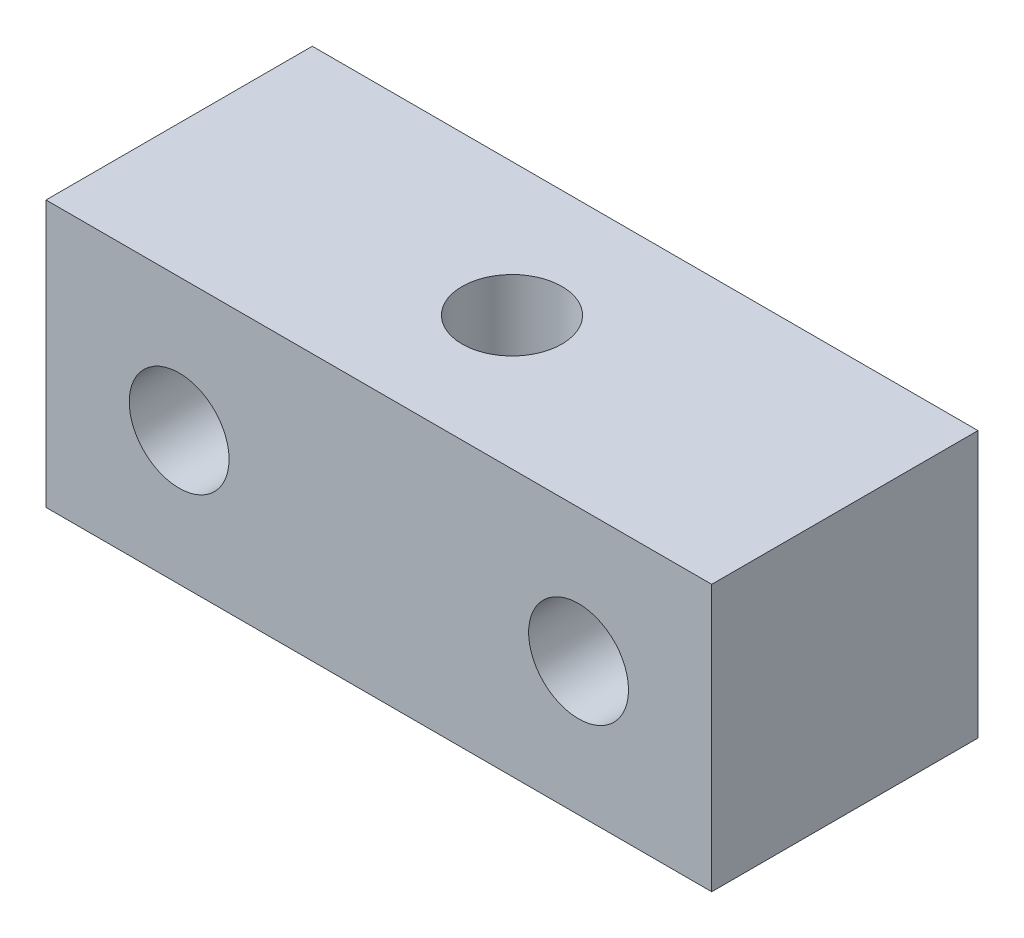
ISO-10303-21;
HEADER;
FILE_DESCRIPTION(('STEP AP214'),'2;1');
FILE_NAME('part.step','',(''),(''),'','','');
FILE_SCHEMA(('AUTOMOTIVE_DESIGN { 1 0 10303 214 1 1 1 1 }'));
ENDSEC;
DATA;
#1=APPLICATION_CONTEXT('core data for automotive mechanical design processes');
#2=APPLICATION_PROTOCOL_DEFINITION('international standard','automotive_design',2000,#1);
#3=PRODUCT_CONTEXT('',#1,'mechanical');
#4=PRODUCT('Part','Part','',(#3));
#5=PRODUCT_RELATED_PRODUCT_CATEGORY('part','',(#4));
#6=PRODUCT_DEFINITION_FORMATION('','',#4);
#7=PRODUCT_DEFINITION_CONTEXT('part definition',#1,'design');
#8=PRODUCT_DEFINITION('design','',#6,#7);
#9=PRODUCT_DEFINITION_SHAPE('','',#8);
#10=(LENGTH_UNIT() NAMED_UNIT(*) SI_UNIT(.MILLI.,.METRE.));
#11=(NAMED_UNIT(*) PLANE_ANGLE_UNIT() SI_UNIT($,.RADIAN.));
#12=(NAMED_UNIT(*) SI_UNIT($,.STERADIAN.) SOLID_ANGLE_UNIT());
#13=UNCERTAINTY_MEASURE_WITH_UNIT(LENGTH_MEASURE(1.E-05),#10,'distance_accuracy_value','');
#14=(GEOMETRIC_REPRESENTATION_CONTEXT(3) GLOBAL_UNCERTAINTY_ASSIGNED_CONTEXT((#13)) GLOBAL_UNIT_ASSIGNED_CONTEXT((#10,
#11,#12)) REPRESENTATION_CONTEXT('',''));
#15=CARTESIAN_POINT('',(0.,0.,0.));
#16=DIRECTION('',(0.,0.,1.));
#17=DIRECTION('',(1.,0.,0.));
#18=AXIS2_PLACEMENT_3D('',#15,#16,#17);
#19=CARTESIAN_POINT('',(20.,0.,0.));
#20=DIRECTION('',(0.,0.,-1.));
#21=DIRECTION('',(-1.,0.,0.));
#22=AXIS2_PLACEMENT_3D('',#19,#20,#21);
#23=PLANE('',#22);
#24=CARTESIAN_POINT('',(16.,4.,0.));
#25=DIRECTION('',(0.,0.,1.));
#26=DIRECTION('',(1.,0.,0.));
#27=AXIS2_PLACEMENT_3D('',#24,#25,#26);
#28=CIRCLE('',#27,1.5);
#29=CARTESIAN_POINT('',(17.5,4.,0.));
#30=VERTEX_POINT('',#29);
#31=EDGE_CURVE('E117',#30,#30,#28,.T.);
#32=ORIENTED_EDGE('',*,*,#31,.F.);
#33=EDGE_LOOP('',(#32));
#34=FACE_BOUND('',#33,.T.);
#35=CARTESIAN_POINT('',(4.,4.,0.));
#36=DIRECTION('',(0.,0.,1.));
#37=DIRECTION('',(1.,0.,0.));
#38=AXIS2_PLACEMENT_3D('',#35,#36,#37);
#39=CIRCLE('',#38,1.5);
#40=CARTESIAN_POINT('',(5.5,4.,0.));
#41=VERTEX_POINT('',#40);
#42=EDGE_CURVE('E111',#41,#41,#39,.T.);
#43=ORIENTED_EDGE('',*,*,#42,.F.);
#44=EDGE_LOOP('',(#43));
#45=FACE_BOUND('',#44,.T.);
#46=DIRECTION('',(0.,-1.,0.));
#47=VECTOR('',#46,1.);
#48=CARTESIAN_POINT('',(0.,0.,0.));
#49=LINE('',#48,#47);
#50=CARTESIAN_POINT('',(0.,8.,0.));
#51=VERTEX_POINT('',#50);
#52=CARTESIAN_POINT('',(0.,0.,0.));
#53=VERTEX_POINT('',#52);
#54=EDGE_CURVE('E97',#51,#53,#49,.T.);
#55=ORIENTED_EDGE('',*,*,#54,.T.);
#56=DIRECTION('',(-1.,0.,0.));
#57=VECTOR('',#56,1.);
#58=CARTESIAN_POINT('',(20.,0.,0.));
#59=LINE('',#58,#57);
#60=CARTESIAN_POINT('',(20.,0.,0.));
#61=VERTEX_POINT('',#60);
#62=EDGE_CURVE('E11',#61,#53,#59,.T.);
#63=ORIENTED_EDGE('',*,*,#62,.F.);
#64=DIRECTION('',(0.,-1.,0.));
#65=VECTOR('',#64,1.);
#66=CARTESIAN_POINT('',(20.,0.,0.));
#67=LINE('',#66,#65);
#68=CARTESIAN_POINT('',(20.,8.,0.));
#69=VERTEX_POINT('',#68);
#70=EDGE_CURVE('E85',#69,#61,#67,.T.);
#71=ORIENTED_EDGE('',*,*,#70,.F.);
#72=DIRECTION('',(-1.,0.,0.));
#73=VECTOR('',#72,1.);
#74=CARTESIAN_POINT('',(20.,8.,0.));
#75=LINE('',#74,#73);
#76=EDGE_CURVE('E93',#69,#51,#75,.T.);
#77=ORIENTED_EDGE('',*,*,#76,.T.);
#78=EDGE_LOOP('',(#55,#63,#71,#77));
#79=FACE_BOUND('',#78,.T.);
#80=ADVANCED_FACE('F34',(#34,#45,#79),#23,.F.);
#81=CARTESIAN_POINT('',(20.,0.,0.));
#82=DIRECTION('',(0.,1.,0.));
#83=DIRECTION('',(0.,0.,1.));
#84=AXIS2_PLACEMENT_3D('',#81,#82,#83);
#85=PLANE('',#84);
#86=CARTESIAN_POINT('',(10.,0.,-4.));
#87=DIRECTION('',(0.,1.,0.));
#88=DIRECTION('',(0.,0.,1.));
#89=AXIS2_PLACEMENT_3D('',#86,#87,#88);
#90=CIRCLE('',#89,1.5);
#91=CARTESIAN_POINT('',(10.,0.,-2.5));
#92=VERTEX_POINT('',#91);
#93=EDGE_CURVE('E120',#92,#92,#90,.T.);
#94=ORIENTED_EDGE('',*,*,#93,.T.);
#95=EDGE_LOOP('',(#94));
#96=FACE_BOUND('',#95,.T.);
#97=DIRECTION('',(0.,0.,-1.));
#98=VECTOR('',#97,1.);
#99=CARTESIAN_POINT('',(0.,0.,0.));
#100=LINE('',#99,#98);
#101=CARTESIAN_POINT('',(0.,0.,-8.));
#102=VERTEX_POINT('',#101);
#103=EDGE_CURVE('E89',#53,#102,#100,.T.);
#104=ORIENTED_EDGE('',*,*,#103,.T.);
#105=DIRECTION('',(-1.,0.,0.));
#106=VECTOR('',#105,1.);
#107=CARTESIAN_POINT('',(20.,0.,-8.));
#108=LINE('',#107,#106);
#109=CARTESIAN_POINT('',(20.,0.,-8.));
#110=VERTEX_POINT('',#109);
#111=EDGE_CURVE('E42',#110,#102,#108,.T.);
#112=ORIENTED_EDGE('',*,*,#111,.F.);
#113=DIRECTION('',(0.,0.,-1.));
#114=VECTOR('',#113,1.);
#115=CARTESIAN_POINT('',(20.,0.,0.));
#116=LINE('',#115,#114);
#117=EDGE_CURVE('E80',#61,#110,#116,.T.);
#118=ORIENTED_EDGE('',*,*,#117,.F.);
#119=ORIENTED_EDGE('',*,*,#62,.T.);
#120=EDGE_LOOP('',(#104,#112,#118,#119));
#121=FACE_BOUND('',#120,.T.);
#122=ADVANCED_FACE('F88',(#96,#121),#85,.F.);
#123=CARTESIAN_POINT('',(20.,0.,-8.));
#124=DIRECTION('',(0.,0.,1.));
#125=DIRECTION('',(1.,0.,0.));
#126=AXIS2_PLACEMENT_3D('',#123,#124,#125);
#127=PLANE('',#126);
#128=CARTESIAN_POINT('',(16.,4.,-8.));
#129=DIRECTION('',(0.,0.,1.));
#130=DIRECTION('',(1.,0.,0.));
#131=AXIS2_PLACEMENT_3D('',#128,#129,#130);
#132=CIRCLE('',#131,1.5);
#133=CARTESIAN_POINT('',(17.5,4.,-8.));
#134=VERTEX_POINT('',#133);
#135=EDGE_CURVE('E114',#134,#134,#132,.T.);
#136=ORIENTED_EDGE('',*,*,#135,.T.);
#137=EDGE_LOOP('',(#136));
#138=FACE_BOUND('',#137,.T.);
#139=CARTESIAN_POINT('',(4.,4.,-8.));
#140=DIRECTION('',(0.,0.,1.));
#141=DIRECTION('',(1.,0.,0.));
#142=AXIS2_PLACEMENT_3D('',#139,#140,#141);
#143=CIRCLE('',#142,1.5);
#144=CARTESIAN_POINT('',(5.5,4.,-8.));
#145=VERTEX_POINT('',#144);
#146=EDGE_CURVE('E100',#145,#145,#143,.T.);
#147=ORIENTED_EDGE('',*,*,#146,.T.);
#148=EDGE_LOOP('',(#147));
#149=FACE_BOUND('',#148,.T.);
#150=DIRECTION('',(0.,1.,0.));
#151=VECTOR('',#150,1.);
#152=CARTESIAN_POINT('',(0.,0.,-8.));
#153=LINE('',#152,#151);
#154=CARTESIAN_POINT('',(0.,8.,-8.));
#155=VERTEX_POINT('',#154);
#156=EDGE_CURVE('E67',#102,#155,#153,.T.);
#157=ORIENTED_EDGE('',*,*,#156,.T.);
#158=DIRECTION('',(-1.,0.,0.));
#159=VECTOR('',#158,1.);
#160=CARTESIAN_POINT('',(20.,8.,-8.));
#161=LINE('',#160,#159);
#162=CARTESIAN_POINT('',(20.,8.,-8.));
#163=VERTEX_POINT('',#162);
#164=EDGE_CURVE('E90',#163,#155,#161,.T.);
#165=ORIENTED_EDGE('',*,*,#164,.F.);
#166=DIRECTION('',(0.,1.,0.));
#167=VECTOR('',#166,1.);
#168=CARTESIAN_POINT('',(20.,0.,-8.));
#169=LINE('',#168,#167);
#170=EDGE_CURVE('E83',#110,#163,#169,.T.);
#171=ORIENTED_EDGE('',*,*,#170,.F.);
#172=ORIENTED_EDGE('',*,*,#111,.T.);
#173=EDGE_LOOP('',(#157,#165,#171,#172));
#174=FACE_BOUND('',#173,.T.);
#175=ADVANCED_FACE('F91',(#138,#149,#174),#127,.F.);
#176=CARTESIAN_POINT('',(20.,8.,0.));
#177=DIRECTION('',(0.,-1.,0.));
#178=DIRECTION('',(0.,0.,-1.));
#179=AXIS2_PLACEMENT_3D('',#176,#177,#178);
#180=PLANE('',#179);
#181=CARTESIAN_POINT('',(10.,8.,-4.));
#182=DIRECTION('',(0.,1.,0.));
#183=DIRECTION('',(0.,0.,1.));
#184=AXIS2_PLACEMENT_3D('',#181,#182,#183);
#185=CIRCLE('',#184,1.5);
#186=CARTESIAN_POINT('',(10.,8.,-2.5));
#187=VERTEX_POINT('',#186);
#188=EDGE_CURVE('E123',#187,#187,#185,.T.);
#189=ORIENTED_EDGE('',*,*,#188,.F.);
#190=EDGE_LOOP('',(#189));
#191=FACE_BOUND('',#190,.T.);
#192=DIRECTION('',(0.,0.,1.));
#193=VECTOR('',#192,1.);
#194=CARTESIAN_POINT('',(0.,8.,0.));
#195=LINE('',#194,#193);
#196=EDGE_CURVE('E73',#155,#51,#195,.T.);
#197=ORIENTED_EDGE('',*,*,#196,.T.);
#198=ORIENTED_EDGE('',*,*,#76,.F.);
#199=DIRECTION('',(0.,0.,1.));
#200=VECTOR('',#199,1.);
#201=CARTESIAN_POINT('',(20.,8.,0.));
#202=LINE('',#201,#200);
#203=EDGE_CURVE('E50',#163,#69,#202,.T.);
#204=ORIENTED_EDGE('',*,*,#203,.F.);
#205=ORIENTED_EDGE('',*,*,#164,.T.);
#206=EDGE_LOOP('',(#197,#198,#204,#205));
#207=FACE_BOUND('',#206,.T.);
#208=ADVANCED_FACE('F105',(#191,#207),#180,.F.);
#209=CARTESIAN_POINT('',(20.,0.,0.));
#210=DIRECTION('',(-1.,0.,0.));
#211=DIRECTION('',(0.,0.,1.));
#212=AXIS2_PLACEMENT_3D('',#209,#210,#211);
#213=PLANE('',#212);
#214=ORIENTED_EDGE('',*,*,#70,.T.);
#215=ORIENTED_EDGE('',*,*,#117,.T.);
#216=ORIENTED_EDGE('',*,*,#170,.T.);
#217=ORIENTED_EDGE('',*,*,#203,.T.);
#218=EDGE_LOOP('',(#214,#215,#216,#217));
#219=FACE_BOUND('',#218,.T.);
#220=ADVANCED_FACE('F81',(#219),#213,.F.);
#221=CARTESIAN_POINT('',(0.,0.,0.));
#222=DIRECTION('',(-1.,0.,0.));
#223=DIRECTION('',(0.,0.,1.));
#224=AXIS2_PLACEMENT_3D('',#221,#222,#223);
#225=PLANE('',#224);
#226=ORIENTED_EDGE('',*,*,#54,.F.);
#227=ORIENTED_EDGE('',*,*,#196,.F.);
#228=ORIENTED_EDGE('',*,*,#156,.F.);
#229=ORIENTED_EDGE('',*,*,#103,.F.);
#230=EDGE_LOOP('',(#226,#227,#228,#229));
#231=FACE_BOUND('',#230,.T.);
#232=ADVANCED_FACE('F108',(#231),#225,.T.);
#233=CARTESIAN_POINT('',(4.,4.,-8.));
#234=DIRECTION('',(0.,0.,1.));
#235=DIRECTION('',(1.,0.,0.));
#236=AXIS2_PLACEMENT_3D('',#233,#234,#235);
#237=CYLINDRICAL_SURFACE('',#236,1.5);
#238=ORIENTED_EDGE('',*,*,#146,.F.);
#239=EDGE_LOOP('',(#238));
#240=FACE_BOUND('',#239,.T.);
#241=ORIENTED_EDGE('',*,*,#42,.T.);
#242=EDGE_LOOP('',(#241));
#243=FACE_BOUND('',#242,.T.);
#244=ADVANCED_FACE('F156',(#240,#243),#237,.F.);
#245=CARTESIAN_POINT('',(16.,4.,-8.));
#246=DIRECTION('',(0.,0.,1.));
#247=DIRECTION('',(1.,0.,0.));
#248=AXIS2_PLACEMENT_3D('',#245,#246,#247);
#249=CYLINDRICAL_SURFACE('',#248,1.5);
#250=ORIENTED_EDGE('',*,*,#135,.F.);
#251=EDGE_LOOP('',(#250));
#252=FACE_BOUND('',#251,.T.);
#253=ORIENTED_EDGE('',*,*,#31,.T.);
#254=EDGE_LOOP('',(#253));
#255=FACE_BOUND('',#254,.T.);
#256=ADVANCED_FACE('F133',(#252,#255),#249,.F.);
#257=CARTESIAN_POINT('',(10.,0.,-4.));
#258=DIRECTION('',(0.,1.,0.));
#259=DIRECTION('',(0.,0.,1.));
#260=AXIS2_PLACEMENT_3D('',#257,#258,#259);
#261=CYLINDRICAL_SURFACE('',#260,1.5);
#262=ORIENTED_EDGE('',*,*,#93,.F.);
#263=EDGE_LOOP('',(#262));
#264=FACE_BOUND('',#263,.T.);
#265=ORIENTED_EDGE('',*,*,#188,.T.);
#266=EDGE_LOOP('',(#265));
#267=FACE_BOUND('',#266,.T.);
#268=ADVANCED_FACE('F130',(#264,#267),#261,.F.);
#269=CLOSED_SHELL('',(#80,#122,#175,#208,#220,#232,#244,#256,#268));
#270=MANIFOLD_SOLID_BREP('B2',#269);
#271=ADVANCED_BREP_SHAPE_REPRESENTATION('',(#18,#270),#14);
#272=SHAPE_DEFINITION_REPRESENTATION(#9,#271);
ENDSEC;
END-ISO-10303-21;
